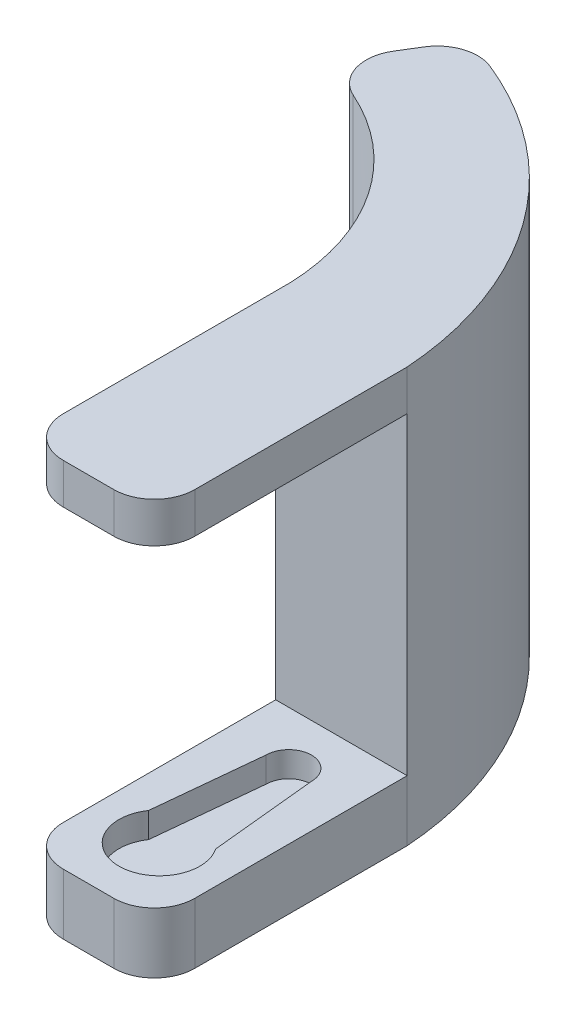
ISO-10303-21;
HEADER;
FILE_DESCRIPTION(('STEP AP214'),'2;1');
FILE_NAME('part.step','',(''),(''),'','','');
FILE_SCHEMA(('AUTOMOTIVE_DESIGN { 1 0 10303 214 1 1 1 1 }'));
ENDSEC;
DATA;
#1=APPLICATION_CONTEXT('core data for automotive mechanical design processes');
#2=APPLICATION_PROTOCOL_DEFINITION('international standard','automotive_design',2000,#1);
#3=PRODUCT_CONTEXT('',#1,'mechanical');
#4=PRODUCT('Part','Part','',(#3));
#5=PRODUCT_RELATED_PRODUCT_CATEGORY('part','',(#4));
#6=PRODUCT_DEFINITION_FORMATION('','',#4);
#7=PRODUCT_DEFINITION_CONTEXT('part definition',#1,'design');
#8=PRODUCT_DEFINITION('design','',#6,#7);
#9=PRODUCT_DEFINITION_SHAPE('','',#8);
#10=(LENGTH_UNIT() NAMED_UNIT(*) SI_UNIT(.MILLI.,.METRE.));
#11=(NAMED_UNIT(*) PLANE_ANGLE_UNIT() SI_UNIT($,.RADIAN.));
#12=(NAMED_UNIT(*) SI_UNIT($,.STERADIAN.) SOLID_ANGLE_UNIT());
#13=UNCERTAINTY_MEASURE_WITH_UNIT(LENGTH_MEASURE(1.E-05),#10,'distance_accuracy_value','');
#14=(GEOMETRIC_REPRESENTATION_CONTEXT(3) GLOBAL_UNCERTAINTY_ASSIGNED_CONTEXT((#13)) GLOBAL_UNIT_ASSIGNED_CONTEXT((#10,
#11,#12)) REPRESENTATION_CONTEXT('',''));
#15=CARTESIAN_POINT('',(0.,0.,0.));
#16=DIRECTION('',(0.,0.,1.));
#17=DIRECTION('',(1.,0.,0.));
#18=AXIS2_PLACEMENT_3D('',#15,#16,#17);
#19=CARTESIAN_POINT('',(-21.8206704125008,41.,-0.67001256969746));
#20=DIRECTION('',(0.,-1.,0.));
#21=DIRECTION('',(0.,0.,-1.));
#22=AXIS2_PLACEMENT_3D('',#19,#20,#21);
#23=CYLINDRICAL_SURFACE('',#22,21.8309544934375);
#24=CARTESIAN_POINT('',(-21.8206704125008,41.,-0.67001256969746));
#25=DIRECTION('',(0.,1.,0.));
#26=DIRECTION('',(0.,0.,1.));
#27=AXIS2_PLACEMENT_3D('',#24,#25,#26);
#28=CIRCLE('',#27,21.8309544934375);
#29=CARTESIAN_POINT('',(0.,41.,0.));
#30=VERTEX_POINT('',#29);
#31=CARTESIAN_POINT('',(-12.9454402488433,41.,-20.6154597603884));
#32=VERTEX_POINT('',#31);
#33=EDGE_CURVE('E294',#30,#32,#28,.T.);
#34=ORIENTED_EDGE('',*,*,#33,.T.);
#35=DIRECTION('',(0.,-1.,0.));
#36=VECTOR('',#35,1.);
#37=CARTESIAN_POINT('',(-12.9454402488433,41.,-20.6154597603884));
#38=LINE('',#37,#36);
#39=CARTESIAN_POINT('',(-12.9454402488433,27.,-20.6154597603884));
#40=VERTEX_POINT('',#39);
#41=EDGE_CURVE('E361',#32,#40,#38,.T.);
#42=ORIENTED_EDGE('',*,*,#41,.T.);
#43=CARTESIAN_POINT('',(-21.8206704125008,27.,-0.67001256969746));
#44=DIRECTION('',(0.,-1.,0.));
#45=DIRECTION('',(0.,0.,-1.));
#46=AXIS2_PLACEMENT_3D('',#43,#44,#45);
#47=CIRCLE('',#46,21.8309544934375);
#48=CARTESIAN_POINT('',(-7.30106149978512,27.,-16.9725133323512));
#49=VERTEX_POINT('',#48);
#50=EDGE_CURVE('E231',#40,#49,#47,.T.);
#51=ORIENTED_EDGE('',*,*,#50,.T.);
#52=DIRECTION('',(0.,-1.,0.));
#53=VECTOR('',#52,1.);
#54=CARTESIAN_POINT('',(-7.30106149978512,27.,-16.9725133323512));
#55=LINE('',#54,#53);
#56=CARTESIAN_POINT('',(-7.30106149978512,9.,-16.9725133323512));
#57=VERTEX_POINT('',#56);
#58=EDGE_CURVE('E230',#49,#57,#55,.T.);
#59=ORIENTED_EDGE('',*,*,#58,.T.);
#60=CARTESIAN_POINT('',(-21.8206704125008,9.,-0.67001256969746));
#61=DIRECTION('',(0.,-1.,0.));
#62=DIRECTION('',(0.,0.,-1.));
#63=AXIS2_PLACEMENT_3D('',#60,#61,#62);
#64=CIRCLE('',#63,21.8309544934375);
#65=CARTESIAN_POINT('',(-12.9454402488433,9.,-20.6154597603884));
#66=VERTEX_POINT('',#65);
#67=EDGE_CURVE('E437',#66,#57,#64,.T.);
#68=ORIENTED_EDGE('',*,*,#67,.F.);
#69=DIRECTION('',(0.,-1.,0.));
#70=VECTOR('',#69,1.);
#71=CARTESIAN_POINT('',(-12.9454402488433,41.,-20.6154597603884));
#72=LINE('',#71,#70);
#73=CARTESIAN_POINT('',(-12.9454402488433,0.,-20.6154597603884));
#74=VERTEX_POINT('',#73);
#75=EDGE_CURVE('E358',#66,#74,#72,.T.);
#76=ORIENTED_EDGE('',*,*,#75,.T.);
#77=CARTESIAN_POINT('',(-21.8206704125008,0.,-0.67001256969746));
#78=DIRECTION('',(0.,1.,0.));
#79=DIRECTION('',(0.,0.,1.));
#80=AXIS2_PLACEMENT_3D('',#77,#78,#79);
#81=CIRCLE('',#80,21.8309544934375);
#82=CARTESIAN_POINT('',(0.,0.,0.));
#83=VERTEX_POINT('',#82);
#84=EDGE_CURVE('E293',#83,#74,#81,.T.);
#85=ORIENTED_EDGE('',*,*,#84,.F.);
#86=DIRECTION('',(0.,-1.,0.));
#87=VECTOR('',#86,1.);
#88=CARTESIAN_POINT('',(0.,6.,0.));
#89=LINE('',#88,#87);
#90=CARTESIAN_POINT('',(0.,6.,0.));
#91=VERTEX_POINT('',#90);
#92=EDGE_CURVE('E282',#91,#83,#89,.T.);
#93=ORIENTED_EDGE('',*,*,#92,.F.);
#94=DIRECTION('',(0.,-1.,0.));
#95=VECTOR('',#94,1.);
#96=CARTESIAN_POINT('',(0.,41.,0.));
#97=LINE('',#96,#95);
#98=CARTESIAN_POINT('',(0.,37.,0.));
#99=VERTEX_POINT('',#98);
#100=EDGE_CURVE('E312',#99,#91,#97,.T.);
#101=ORIENTED_EDGE('',*,*,#100,.F.);
#102=DIRECTION('',(0.,-1.,0.));
#103=VECTOR('',#102,1.);
#104=CARTESIAN_POINT('',(0.,41.,0.));
#105=LINE('',#104,#103);
#106=EDGE_CURVE('E327',#30,#99,#105,.T.);
#107=ORIENTED_EDGE('',*,*,#106,.F.);
#108=EDGE_LOOP('',(#34,#42,#51,#59,#68,#76,#85,#93,#101,#107));
#109=FACE_BOUND('',#108,.T.);
#110=ADVANCED_FACE('F34',(#109),#23,.F.);
#111=CARTESIAN_POINT('',(-21.7491965770978,41.,2.42735962413155));
#112=DIRECTION('',(0.,-1.,0.));
#113=DIRECTION('',(0.,0.,-1.));
#114=AXIS2_PLACEMENT_3D('',#111,#112,#113);
#115=CYLINDRICAL_SURFACE('',#114,34.8338734208334);
#116=CARTESIAN_POINT('',(-21.7491965770978,27.,2.42735962413155));
#117=DIRECTION('',(0.,-1.,0.));
#118=DIRECTION('',(0.,0.,-1.));
#119=AXIS2_PLACEMENT_3D('',#116,#117,#118);
#120=CIRCLE('',#119,34.8338734208334);
#121=CARTESIAN_POINT('',(-8.66476899042789,27.,-29.8557085731114));
#122=VERTEX_POINT('',#121);
#123=CARTESIAN_POINT('',(-1.72066987913425,27.,-26.0727606529411));
#124=VERTEX_POINT('',#123);
#125=EDGE_CURVE('E210',#122,#124,#120,.T.);
#126=ORIENTED_EDGE('',*,*,#125,.F.);
#127=DIRECTION('',(0.,-1.,0.));
#128=VECTOR('',#127,1.);
#129=CARTESIAN_POINT('',(-8.66476899042788,41.,-29.8557085731114));
#130=LINE('',#129,#128);
#131=CARTESIAN_POINT('',(-8.66476899042789,41.,-29.8557085731114));
#132=VERTEX_POINT('',#131);
#133=EDGE_CURVE('E352',#122,#132,#130,.F.);
#134=ORIENTED_EDGE('',*,*,#133,.T.);
#135=CARTESIAN_POINT('',(-21.7491965770978,41.,2.42735962413155));
#136=DIRECTION('',(0.,-1.,0.));
#137=DIRECTION('',(0.,0.,1.));
#138=AXIS2_PLACEMENT_3D('',#135,#136,#137);
#139=CIRCLE('',#138,34.8338734208334);
#140=CARTESIAN_POINT('',(13.,41.,0.));
#141=VERTEX_POINT('',#140);
#142=EDGE_CURVE('E301',#132,#141,#139,.T.);
#143=ORIENTED_EDGE('',*,*,#142,.T.);
#144=DIRECTION('',(0.,-1.,0.));
#145=VECTOR('',#144,1.);
#146=CARTESIAN_POINT('',(13.,41.,0.));
#147=LINE('',#146,#145);
#148=CARTESIAN_POINT('',(13.,37.,0.));
#149=VERTEX_POINT('',#148);
#150=EDGE_CURVE('E339',#141,#149,#147,.T.);
#151=ORIENTED_EDGE('',*,*,#150,.T.);
#152=DIRECTION('',(0.,-1.,0.));
#153=VECTOR('',#152,1.);
#154=CARTESIAN_POINT('',(13.,41.,0.));
#155=LINE('',#154,#153);
#156=CARTESIAN_POINT('',(13.,6.,0.));
#157=VERTEX_POINT('',#156);
#158=EDGE_CURVE('E304',#149,#157,#155,.T.);
#159=ORIENTED_EDGE('',*,*,#158,.T.);
#160=DIRECTION('',(0.,-1.,0.));
#161=VECTOR('',#160,1.);
#162=CARTESIAN_POINT('',(13.,6.,0.));
#163=LINE('',#162,#161);
#164=CARTESIAN_POINT('',(13.,0.,0.));
#165=VERTEX_POINT('',#164);
#166=EDGE_CURVE('E290',#157,#165,#163,.T.);
#167=ORIENTED_EDGE('',*,*,#166,.T.);
#168=CARTESIAN_POINT('',(-21.7491965770978,0.,2.42735962413155));
#169=DIRECTION('',(0.,-1.,0.));
#170=DIRECTION('',(0.,0.,1.));
#171=AXIS2_PLACEMENT_3D('',#168,#169,#170);
#172=CIRCLE('',#171,34.8338734208334);
#173=CARTESIAN_POINT('',(-8.66476899042789,0.,-29.8557085731114));
#174=VERTEX_POINT('',#173);
#175=EDGE_CURVE('E298',#174,#165,#172,.T.);
#176=ORIENTED_EDGE('',*,*,#175,.F.);
#177=DIRECTION('',(0.,-1.,0.));
#178=VECTOR('',#177,1.);
#179=CARTESIAN_POINT('',(-8.66476899042788,41.,-29.8557085731114));
#180=LINE('',#179,#178);
#181=CARTESIAN_POINT('',(-8.66476899042789,9.,-29.8557085731114));
#182=VERTEX_POINT('',#181);
#183=EDGE_CURVE('E350',#174,#182,#180,.F.);
#184=ORIENTED_EDGE('',*,*,#183,.T.);
#185=CARTESIAN_POINT('',(-21.7491965770978,9.,2.42735962413155));
#186=DIRECTION('',(0.,-1.,0.));
#187=DIRECTION('',(0.,0.,-1.));
#188=AXIS2_PLACEMENT_3D('',#185,#186,#187);
#189=CIRCLE('',#188,34.8338734208334);
#190=CARTESIAN_POINT('',(-1.72066987913425,9.,-26.0727606529411));
#191=VERTEX_POINT('',#190);
#192=EDGE_CURVE('E235',#182,#191,#189,.T.);
#193=ORIENTED_EDGE('',*,*,#192,.T.);
#194=DIRECTION('',(0.,-1.,0.));
#195=VECTOR('',#194,1.);
#196=CARTESIAN_POINT('',(-1.72066987913425,27.,-26.0727606529411));
#197=LINE('',#196,#195);
#198=EDGE_CURVE('E227',#124,#191,#197,.T.);
#199=ORIENTED_EDGE('',*,*,#198,.F.);
#200=EDGE_LOOP('',(#126,#134,#143,#151,#159,#167,#176,#184,#193,#199));
#201=FACE_BOUND('',#200,.T.);
#202=ADVANCED_FACE('F233',(#201),#115,.T.);
#203=CARTESIAN_POINT('',(-17.3765441053367,41.,-22.0438357059665));
#204=DIRECTION('',(-0.852483505207797,0.,-0.522754123224894));
#205=DIRECTION('',(-0.522754123224894,0.,0.852483505207797));
#206=AXIS2_PLACEMENT_3D('',#203,#204,#205);
#207=PLANE('',#206);
#208=DIRECTION('',(0.522754123224894,0.,-0.852483505207797));
#209=VECTOR('',#208,1.);
#210=CARTESIAN_POINT('',(-17.3765441053367,41.,-22.0438357059665));
#211=LINE('',#210,#209);
#212=CARTESIAN_POINT('',(-14.7292007248896,41.,-26.3610021599197));
#213=VERTEX_POINT('',#212);
#214=CARTESIAN_POINT('',(-13.5771977156056,41.,-28.2396359568297));
#215=VERTEX_POINT('',#214);
#216=EDGE_CURVE('E297',#213,#215,#211,.T.);
#217=ORIENTED_EDGE('',*,*,#216,.T.);
#218=DIRECTION('',(0.,-1.,0.));
#219=VECTOR('',#218,1.);
#220=CARTESIAN_POINT('',(-13.5771977156056,41.,-28.2396359568297));
#221=LINE('',#220,#219);
#222=CARTESIAN_POINT('',(-13.5771977156056,27.,-28.2396359568297));
#223=VERTEX_POINT('',#222);
#224=EDGE_CURVE('E344',#215,#223,#221,.T.);
#225=ORIENTED_EDGE('',*,*,#224,.T.);
#226=DIRECTION('',(0.522754123224895,0.,-0.852483505207797));
#227=VECTOR('',#226,1.);
#228=CARTESIAN_POINT('',(-22.4516221384649,27.,-13.767630662964));
#229=LINE('',#228,#227);
#230=CARTESIAN_POINT('',(-14.7292007248896,27.,-26.3610021599197));
#231=VERTEX_POINT('',#230);
#232=EDGE_CURVE('E220',#231,#223,#229,.T.);
#233=ORIENTED_EDGE('',*,*,#232,.F.);
#234=DIRECTION('',(0.,-1.,0.));
#235=VECTOR('',#234,1.);
#236=CARTESIAN_POINT('',(-14.7292007248896,41.,-26.3610021599197));
#237=LINE('',#236,#235);
#238=EDGE_CURVE('E342',#231,#213,#237,.F.);
#239=ORIENTED_EDGE('',*,*,#238,.T.);
#240=EDGE_LOOP('',(#217,#225,#233,#239));
#241=FACE_BOUND('',#240,.T.);
#242=ADVANCED_FACE('F473',(#241),#207,.T.);
#243=CARTESIAN_POINT('',(0.,41.,0.));
#244=DIRECTION('',(1.,0.,0.));
#245=DIRECTION('',(0.,0.,-1.));
#246=AXIS2_PLACEMENT_3D('',#243,#244,#245);
#247=PLANE('',#246);
#248=DIRECTION('',(0.,0.,1.));
#249=VECTOR('',#248,1.);
#250=CARTESIAN_POINT('',(0.,37.,0.));
#251=LINE('',#250,#249);
#252=CARTESIAN_POINT('',(0.,37.,21.));
#253=VERTEX_POINT('',#252);
#254=EDGE_CURVE('E315',#99,#253,#251,.T.);
#255=ORIENTED_EDGE('',*,*,#254,.T.);
#256=DIRECTION('',(0.,-1.,0.));
#257=VECTOR('',#256,1.);
#258=CARTESIAN_POINT('',(0.,41.,21.));
#259=LINE('',#258,#257);
#260=CARTESIAN_POINT('',(0.,41.,21.));
#261=VERTEX_POINT('',#260);
#262=EDGE_CURVE('E386',#253,#261,#259,.F.);
#263=ORIENTED_EDGE('',*,*,#262,.T.);
#264=DIRECTION('',(0.,0.,1.));
#265=VECTOR('',#264,1.);
#266=CARTESIAN_POINT('',(0.,41.,0.));
#267=LINE('',#266,#265);
#268=EDGE_CURVE('E318',#30,#261,#267,.T.);
#269=ORIENTED_EDGE('',*,*,#268,.F.);
#270=ORIENTED_EDGE('',*,*,#106,.T.);
#271=EDGE_LOOP('',(#255,#263,#269,#270));
#272=FACE_BOUND('',#271,.T.);
#273=ADVANCED_FACE('F499',(#272),#247,.F.);
#274=CARTESIAN_POINT('',(0.,41.,25.));
#275=DIRECTION('',(0.,0.,-1.));
#276=DIRECTION('',(-1.,0.,0.));
#277=AXIS2_PLACEMENT_3D('',#274,#275,#276);
#278=PLANE('',#277);
#279=DIRECTION('',(1.,0.,0.));
#280=VECTOR('',#279,1.);
#281=CARTESIAN_POINT('',(0.,41.,25.));
#282=LINE('',#281,#280);
#283=CARTESIAN_POINT('',(4.,41.,25.));
#284=VERTEX_POINT('',#283);
#285=CARTESIAN_POINT('',(9.,41.,25.));
#286=VERTEX_POINT('',#285);
#287=EDGE_CURVE('E321',#284,#286,#282,.T.);
#288=ORIENTED_EDGE('',*,*,#287,.F.);
#289=DIRECTION('',(0.,-1.,0.));
#290=VECTOR('',#289,1.);
#291=CARTESIAN_POINT('',(4.,41.,25.));
#292=LINE('',#291,#290);
#293=CARTESIAN_POINT('',(4.,37.,25.));
#294=VERTEX_POINT('',#293);
#295=EDGE_CURVE('E379',#284,#294,#292,.T.);
#296=ORIENTED_EDGE('',*,*,#295,.T.);
#297=DIRECTION('',(1.,0.,0.));
#298=VECTOR('',#297,1.);
#299=CARTESIAN_POINT('',(0.,37.,25.));
#300=LINE('',#299,#298);
#301=CARTESIAN_POINT('',(9.,37.,25.));
#302=VERTEX_POINT('',#301);
#303=EDGE_CURVE('E330',#294,#302,#300,.T.);
#304=ORIENTED_EDGE('',*,*,#303,.T.);
#305=DIRECTION('',(0.,-1.,0.));
#306=VECTOR('',#305,1.);
#307=CARTESIAN_POINT('',(9.,41.,25.));
#308=LINE('',#307,#306);
#309=EDGE_CURVE('E377',#302,#286,#308,.F.);
#310=ORIENTED_EDGE('',*,*,#309,.T.);
#311=EDGE_LOOP('',(#288,#296,#304,#310));
#312=FACE_BOUND('',#311,.T.);
#313=ADVANCED_FACE('F494',(#312),#278,.F.);
#314=CARTESIAN_POINT('',(13.,41.,0.));
#315=DIRECTION('',(-1.,0.,0.));
#316=DIRECTION('',(0.,0.,1.));
#317=AXIS2_PLACEMENT_3D('',#314,#315,#316);
#318=PLANE('',#317);
#319=DIRECTION('',(0.,0.,-1.));
#320=VECTOR('',#319,1.);
#321=CARTESIAN_POINT('',(13.,41.,0.));
#322=LINE('',#321,#320);
#323=CARTESIAN_POINT('',(13.,41.,21.));
#324=VERTEX_POINT('',#323);
#325=EDGE_CURVE('E325',#324,#141,#322,.T.);
#326=ORIENTED_EDGE('',*,*,#325,.F.);
#327=DIRECTION('',(0.,-1.,0.));
#328=VECTOR('',#327,1.);
#329=CARTESIAN_POINT('',(13.,41.,21.));
#330=LINE('',#329,#328);
#331=CARTESIAN_POINT('',(13.,37.,21.));
#332=VERTEX_POINT('',#331);
#333=EDGE_CURVE('E392',#324,#332,#330,.T.);
#334=ORIENTED_EDGE('',*,*,#333,.T.);
#335=DIRECTION('',(0.,0.,-1.));
#336=VECTOR('',#335,1.);
#337=CARTESIAN_POINT('',(13.,37.,0.));
#338=LINE('',#337,#336);
#339=EDGE_CURVE('E333',#332,#149,#338,.T.);
#340=ORIENTED_EDGE('',*,*,#339,.T.);
#341=ORIENTED_EDGE('',*,*,#150,.F.);
#342=EDGE_LOOP('',(#326,#334,#340,#341));
#343=FACE_BOUND('',#342,.T.);
#344=ADVANCED_FACE('F484',(#343),#318,.F.);
#345=CARTESIAN_POINT('',(0.,41.,0.));
#346=DIRECTION('',(0.,1.,0.));
#347=DIRECTION('',(0.,0.,1.));
#348=AXIS2_PLACEMENT_3D('',#345,#346,#347);
#349=PLANE('',#348);
#350=ORIENTED_EDGE('',*,*,#268,.T.);
#351=CARTESIAN_POINT('',(4.,41.,21.));
#352=DIRECTION('',(0.,1.,0.));
#353=DIRECTION('',(0.,0.,1.));
#354=AXIS2_PLACEMENT_3D('',#351,#352,#353);
#355=CIRCLE('',#354,4.);
#356=EDGE_CURVE('E390',#261,#284,#355,.T.);
#357=ORIENTED_EDGE('',*,*,#356,.T.);
#358=ORIENTED_EDGE('',*,*,#287,.T.);
#359=CARTESIAN_POINT('',(9.,41.,21.));
#360=DIRECTION('',(0.,1.,0.));
#361=DIRECTION('',(0.,0.,1.));
#362=AXIS2_PLACEMENT_3D('',#359,#360,#361);
#363=CIRCLE('',#362,4.);
#364=EDGE_CURVE('E388',#286,#324,#363,.T.);
#365=ORIENTED_EDGE('',*,*,#364,.T.);
#366=ORIENTED_EDGE('',*,*,#325,.T.);
#367=ORIENTED_EDGE('',*,*,#142,.F.);
#368=CARTESIAN_POINT('',(-10.1672636947744,41.,-26.1486194639301));
#369=DIRECTION('',(0.,1.,0.));
#370=DIRECTION('',(0.,0.,1.));
#371=AXIS2_PLACEMENT_3D('',#368,#369,#370);
#372=CIRCLE('',#371,4.);
#373=EDGE_CURVE('E356',#132,#215,#372,.T.);
#374=ORIENTED_EDGE('',*,*,#373,.T.);
#375=ORIENTED_EDGE('',*,*,#216,.F.);
#376=CARTESIAN_POINT('',(-11.3192667040584,41.,-24.2699856670201));
#377=DIRECTION('',(0.,1.,0.));
#378=DIRECTION('',(0.,0.,1.));
#379=AXIS2_PLACEMENT_3D('',#376,#377,#378);
#380=CIRCLE('',#379,4.);
#381=EDGE_CURVE('E354',#213,#32,#380,.T.);
#382=ORIENTED_EDGE('',*,*,#381,.T.);
#383=ORIENTED_EDGE('',*,*,#33,.F.);
#384=EDGE_LOOP('',(#350,#357,#358,#365,#366,#367,#374,#375,#382,#383));
#385=FACE_BOUND('',#384,.T.);
#386=ADVANCED_FACE('F464',(#385),#349,.T.);
#387=CARTESIAN_POINT('',(0.,37.,0.));
#388=DIRECTION('',(0.,1.,0.));
#389=DIRECTION('',(0.,0.,1.));
#390=AXIS2_PLACEMENT_3D('',#387,#388,#389);
#391=PLANE('',#390);
#392=ORIENTED_EDGE('',*,*,#303,.F.);
#393=CARTESIAN_POINT('',(4.,37.,21.));
#394=DIRECTION('',(0.,1.,0.));
#395=DIRECTION('',(0.,0.,1.));
#396=AXIS2_PLACEMENT_3D('',#393,#394,#395);
#397=CIRCLE('',#396,4.);
#398=EDGE_CURVE('E384',#294,#253,#397,.F.);
#399=ORIENTED_EDGE('',*,*,#398,.T.);
#400=ORIENTED_EDGE('',*,*,#254,.F.);
#401=DIRECTION('',(-1.,0.,0.));
#402=VECTOR('',#401,1.);
#403=CARTESIAN_POINT('',(0.,37.,0.));
#404=LINE('',#403,#402);
#405=EDGE_CURVE('E322',#149,#99,#404,.T.);
#406=ORIENTED_EDGE('',*,*,#405,.F.);
#407=ORIENTED_EDGE('',*,*,#339,.F.);
#408=CARTESIAN_POINT('',(9.,37.,21.));
#409=DIRECTION('',(0.,1.,0.));
#410=DIRECTION('',(0.,0.,1.));
#411=AXIS2_PLACEMENT_3D('',#408,#409,#410);
#412=CIRCLE('',#411,4.);
#413=EDGE_CURVE('E382',#332,#302,#412,.F.);
#414=ORIENTED_EDGE('',*,*,#413,.T.);
#415=EDGE_LOOP('',(#392,#399,#400,#406,#407,#414));
#416=FACE_BOUND('',#415,.T.);
#417=ADVANCED_FACE('F491',(#416),#391,.F.);
#418=CARTESIAN_POINT('',(0.,41.,0.));
#419=DIRECTION('',(0.,0.,1.));
#420=DIRECTION('',(1.,0.,0.));
#421=AXIS2_PLACEMENT_3D('',#418,#419,#420);
#422=PLANE('',#421);
#423=DIRECTION('',(-1.,0.,0.));
#424=VECTOR('',#423,1.);
#425=CARTESIAN_POINT('',(0.,6.,0.));
#426=LINE('',#425,#424);
#427=EDGE_CURVE('E280',#157,#91,#426,.T.);
#428=ORIENTED_EDGE('',*,*,#427,.F.);
#429=ORIENTED_EDGE('',*,*,#158,.F.);
#430=ORIENTED_EDGE('',*,*,#405,.T.);
#431=ORIENTED_EDGE('',*,*,#100,.T.);
#432=EDGE_LOOP('',(#428,#429,#430,#431));
#433=FACE_BOUND('',#432,.T.);
#434=ADVANCED_FACE('F457',(#433),#422,.T.);
#435=DIRECTION('',(0.522754123224894,0.,-0.852483505207797));
#436=VECTOR('',#435,1.);
#437=CARTESIAN_POINT('',(-17.3765441053367,0.,-22.0438357059665));
#438=LINE('',#437,#436);
#439=CARTESIAN_POINT('',(-14.7292007248896,0.,-26.3610021599197));
#440=VERTEX_POINT('',#439);
#441=CARTESIAN_POINT('',(-13.5771977156056,0.,-28.2396359568297));
#442=VERTEX_POINT('',#441);
#443=EDGE_CURVE('E307',#440,#442,#438,.T.);
#444=ORIENTED_EDGE('',*,*,#443,.F.);
#445=DIRECTION('',(0.,-1.,0.));
#446=VECTOR('',#445,1.);
#447=CARTESIAN_POINT('',(-14.7292007248896,41.,-26.3610021599197));
#448=LINE('',#447,#446);
#449=CARTESIAN_POINT('',(-14.7292007248896,9.,-26.3610021599197));
#450=VERTEX_POINT('',#449);
#451=EDGE_CURVE('E371',#440,#450,#448,.F.);
#452=ORIENTED_EDGE('',*,*,#451,.T.);
#453=DIRECTION('',(0.522754123224895,0.,-0.852483505207797));
#454=VECTOR('',#453,1.);
#455=CARTESIAN_POINT('',(-22.4516221384649,9.,-13.767630662964));
#456=LINE('',#455,#454);
#457=CARTESIAN_POINT('',(-13.5771977156056,9.,-28.2396359568297));
#458=VERTEX_POINT('',#457);
#459=EDGE_CURVE('E438',#450,#458,#456,.T.);
#460=ORIENTED_EDGE('',*,*,#459,.T.);
#461=DIRECTION('',(0.,-1.,0.));
#462=VECTOR('',#461,1.);
#463=CARTESIAN_POINT('',(-13.5771977156056,41.,-28.2396359568297));
#464=LINE('',#463,#462);
#465=EDGE_CURVE('E368',#458,#442,#464,.T.);
#466=ORIENTED_EDGE('',*,*,#465,.T.);
#467=EDGE_LOOP('',(#444,#452,#460,#466));
#468=FACE_BOUND('',#467,.T.);
#469=ADVANCED_FACE('F429',(#468),#207,.T.);
#470=CARTESIAN_POINT('',(-21.8206704125008,0.,-0.67001256969746));
#471=DIRECTION('',(0.,1.,0.));
#472=DIRECTION('',(0.,0.,1.));
#473=AXIS2_PLACEMENT_3D('',#470,#471,#472);
#474=PLANE('',#473);
#475=DIRECTION('',(1.,0.,0.));
#476=VECTOR('',#475,1.);
#477=CARTESIAN_POINT('',(0.,0.,25.));
#478=LINE('',#477,#476);
#479=CARTESIAN_POINT('',(4.,0.,25.));
#480=VERTEX_POINT('',#479);
#481=CARTESIAN_POINT('',(9.,0.,25.));
#482=VERTEX_POINT('',#481);
#483=EDGE_CURVE('E284',#480,#482,#478,.T.);
#484=ORIENTED_EDGE('',*,*,#483,.F.);
#485=CARTESIAN_POINT('',(4.,0.,21.));
#486=DIRECTION('',(0.,1.,0.));
#487=DIRECTION('',(0.,0.,1.));
#488=AXIS2_PLACEMENT_3D('',#485,#486,#487);
#489=CIRCLE('',#488,4.);
#490=CARTESIAN_POINT('',(0.,0.,21.));
#491=VERTEX_POINT('',#490);
#492=EDGE_CURVE('E402',#480,#491,#489,.F.);
#493=ORIENTED_EDGE('',*,*,#492,.T.);
#494=DIRECTION('',(0.,0.,1.));
#495=VECTOR('',#494,1.);
#496=CARTESIAN_POINT('',(0.,0.,0.));
#497=LINE('',#496,#495);
#498=EDGE_CURVE('E266',#83,#491,#497,.T.);
#499=ORIENTED_EDGE('',*,*,#498,.F.);
#500=ORIENTED_EDGE('',*,*,#84,.T.);
#501=CARTESIAN_POINT('',(-11.3192667040584,0.,-24.2699856670201));
#502=DIRECTION('',(0.,1.,0.));
#503=DIRECTION('',(0.,0.,1.));
#504=AXIS2_PLACEMENT_3D('',#501,#502,#503);
#505=CIRCLE('',#504,4.);
#506=EDGE_CURVE('E366',#74,#440,#505,.F.);
#507=ORIENTED_EDGE('',*,*,#506,.T.);
#508=ORIENTED_EDGE('',*,*,#443,.T.);
#509=CARTESIAN_POINT('',(-10.1672636947744,0.,-26.1486194639301));
#510=DIRECTION('',(0.,1.,0.));
#511=DIRECTION('',(0.,0.,1.));
#512=AXIS2_PLACEMENT_3D('',#509,#510,#511);
#513=CIRCLE('',#512,4.);
#514=EDGE_CURVE('E364',#442,#174,#513,.F.);
#515=ORIENTED_EDGE('',*,*,#514,.T.);
#516=ORIENTED_EDGE('',*,*,#175,.T.);
#517=DIRECTION('',(0.,0.,-1.));
#518=VECTOR('',#517,1.);
#519=CARTESIAN_POINT('',(13.,0.,0.));
#520=LINE('',#519,#518);
#521=CARTESIAN_POINT('',(13.,0.,21.));
#522=VERTEX_POINT('',#521);
#523=EDGE_CURVE('E276',#522,#165,#520,.T.);
#524=ORIENTED_EDGE('',*,*,#523,.F.);
#525=CARTESIAN_POINT('',(9.,0.,21.));
#526=DIRECTION('',(0.,1.,0.));
#527=DIRECTION('',(0.,0.,1.));
#528=AXIS2_PLACEMENT_3D('',#525,#526,#527);
#529=CIRCLE('',#528,4.);
#530=EDGE_CURVE('E400',#522,#482,#529,.F.);
#531=ORIENTED_EDGE('',*,*,#530,.T.);
#532=EDGE_LOOP('',(#484,#493,#499,#500,#507,#508,#515,#516,#524,#531));
#533=FACE_BOUND('',#532,.T.);
#534=ADVANCED_FACE('F417',(#533),#474,.F.);
#535=CARTESIAN_POINT('',(0.,6.,0.));
#536=DIRECTION('',(0.,1.,0.));
#537=DIRECTION('',(0.,0.,1.));
#538=AXIS2_PLACEMENT_3D('',#535,#536,#537);
#539=PLANE('',#538);
#540=DIRECTION('',(0.,0.,1.));
#541=VECTOR('',#540,1.);
#542=CARTESIAN_POINT('',(0.,6.,0.));
#543=LINE('',#542,#541);
#544=CARTESIAN_POINT('',(0.,6.,21.));
#545=VERTEX_POINT('',#544);
#546=EDGE_CURVE('E273',#91,#545,#543,.T.);
#547=ORIENTED_EDGE('',*,*,#546,.T.);
#548=CARTESIAN_POINT('',(4.,6.,21.));
#549=DIRECTION('',(0.,1.,0.));
#550=DIRECTION('',(0.,0.,1.));
#551=AXIS2_PLACEMENT_3D('',#548,#549,#550);
#552=CIRCLE('',#551,4.);
#553=CARTESIAN_POINT('',(4.,6.,25.));
#554=VERTEX_POINT('',#553);
#555=EDGE_CURVE('E42',#545,#554,#552,.T.);
#556=ORIENTED_EDGE('',*,*,#555,.T.);
#557=DIRECTION('',(1.,0.,0.));
#558=VECTOR('',#557,1.);
#559=CARTESIAN_POINT('',(0.,6.,25.));
#560=LINE('',#559,#558);
#561=CARTESIAN_POINT('',(9.,6.,25.));
#562=VERTEX_POINT('',#561);
#563=EDGE_CURVE('E275',#554,#562,#560,.T.);
#564=ORIENTED_EDGE('',*,*,#563,.T.);
#565=CARTESIAN_POINT('',(9.,6.,21.));
#566=DIRECTION('',(0.,1.,0.));
#567=DIRECTION('',(0.,0.,1.));
#568=AXIS2_PLACEMENT_3D('',#565,#566,#567);
#569=CIRCLE('',#568,4.);
#570=CARTESIAN_POINT('',(13.,6.,21.));
#571=VERTEX_POINT('',#570);
#572=EDGE_CURVE('E49',#562,#571,#569,.T.);
#573=ORIENTED_EDGE('',*,*,#572,.T.);
#574=DIRECTION('',(0.,0.,-1.));
#575=VECTOR('',#574,1.);
#576=CARTESIAN_POINT('',(13.,6.,0.));
#577=LINE('',#576,#575);
#578=EDGE_CURVE('E278',#571,#157,#577,.T.);
#579=ORIENTED_EDGE('',*,*,#578,.T.);
#580=ORIENTED_EDGE('',*,*,#427,.T.);
#581=EDGE_LOOP('',(#547,#556,#564,#573,#579,#580));
#582=FACE_BOUND('',#581,.T.);
#583=DIRECTION('',(0.0997805220615176,0.,-0.99500947101881));
#584=VECTOR('',#583,1.);
#585=CARTESIAN_POINT('',(4.7247231395392,6.,0.473799853358825));
#586=LINE('',#585,#584);
#587=CARTESIAN_POINT('',(3.19281086116927,6.,15.75));
#588=VERTEX_POINT('',#587);
#589=CARTESIAN_POINT('',(4.25,6.,5.20772998515413));
#590=VERTEX_POINT('',#589);
#591=EDGE_CURVE('E256',#588,#590,#586,.T.);
#592=ORIENTED_EDGE('',*,*,#591,.T.);
#593=CARTESIAN_POINT('',(6.5,6.,5.20772998515413));
#594=DIRECTION('',(0.,1.,0.));
#595=DIRECTION('',(0.,0.,1.));
#596=AXIS2_PLACEMENT_3D('',#593,#594,#595);
#597=CIRCLE('',#596,2.25);
#598=CARTESIAN_POINT('',(8.75,6.,5.20772998515413));
#599=VERTEX_POINT('',#598);
#600=EDGE_CURVE('E237',#590,#599,#597,.F.);
#601=ORIENTED_EDGE('',*,*,#600,.T.);
#602=DIRECTION('',(-0.0997805220615176,0.,-0.99500947101881));
#603=VECTOR('',#602,1.);
#604=CARTESIAN_POINT('',(8.14584687688351,6.,-0.816873484808522));
#605=LINE('',#604,#603);
#606=CARTESIAN_POINT('',(9.80718913883074,6.,15.75));
#607=VERTEX_POINT('',#606);
#608=EDGE_CURVE('E245',#607,#599,#605,.T.);
#609=ORIENTED_EDGE('',*,*,#608,.F.);
#610=CARTESIAN_POINT('',(6.5,6.,18.));
#611=DIRECTION('',(0.,1.,0.));
#612=DIRECTION('',(0.,0.,1.));
#613=AXIS2_PLACEMENT_3D('',#610,#611,#612);
#614=CIRCLE('',#613,4.);
#615=EDGE_CURVE('E259',#588,#607,#614,.T.);
#616=ORIENTED_EDGE('',*,*,#615,.F.);
#617=EDGE_LOOP('',(#592,#601,#609,#616));
#618=FACE_BOUND('',#617,.T.);
#619=ADVANCED_FACE('F407',(#582,#618),#539,.T.);
#620=CARTESIAN_POINT('',(0.,6.,0.));
#621=DIRECTION('',(1.,0.,0.));
#622=DIRECTION('',(0.,0.,-1.));
#623=AXIS2_PLACEMENT_3D('',#620,#621,#622);
#624=PLANE('',#623);
#625=ORIENTED_EDGE('',*,*,#498,.T.);
#626=DIRECTION('',(0.,-1.,0.));
#627=VECTOR('',#626,1.);
#628=CARTESIAN_POINT('',(0.,6.,21.));
#629=LINE('',#628,#627);
#630=EDGE_CURVE('E57',#491,#545,#629,.F.);
#631=ORIENTED_EDGE('',*,*,#630,.T.);
#632=ORIENTED_EDGE('',*,*,#546,.F.);
#633=ORIENTED_EDGE('',*,*,#92,.T.);
#634=EDGE_LOOP('',(#625,#631,#632,#633));
#635=FACE_BOUND('',#634,.T.);
#636=ADVANCED_FACE('F418',(#635),#624,.F.);
#637=CARTESIAN_POINT('',(0.,6.,25.));
#638=DIRECTION('',(0.,0.,-1.));
#639=DIRECTION('',(-1.,0.,0.));
#640=AXIS2_PLACEMENT_3D('',#637,#638,#639);
#641=PLANE('',#640);
#642=ORIENTED_EDGE('',*,*,#563,.F.);
#643=DIRECTION('',(0.,-1.,0.));
#644=VECTOR('',#643,1.);
#645=CARTESIAN_POINT('',(4.,6.,25.));
#646=LINE('',#645,#644);
#647=EDGE_CURVE('E397',#554,#480,#646,.T.);
#648=ORIENTED_EDGE('',*,*,#647,.T.);
#649=ORIENTED_EDGE('',*,*,#483,.T.);
#650=DIRECTION('',(0.,-1.,0.));
#651=VECTOR('',#650,1.);
#652=CARTESIAN_POINT('',(9.,6.,25.));
#653=LINE('',#652,#651);
#654=EDGE_CURVE('E395',#482,#562,#653,.F.);
#655=ORIENTED_EDGE('',*,*,#654,.T.);
#656=EDGE_LOOP('',(#642,#648,#649,#655));
#657=FACE_BOUND('',#656,.T.);
#658=ADVANCED_FACE('F412',(#657),#641,.F.);
#659=CARTESIAN_POINT('',(13.,6.,0.));
#660=DIRECTION('',(-1.,0.,0.));
#661=DIRECTION('',(0.,0.,1.));
#662=AXIS2_PLACEMENT_3D('',#659,#660,#661);
#663=PLANE('',#662);
#664=ORIENTED_EDGE('',*,*,#578,.F.);
#665=DIRECTION('',(0.,-1.,0.));
#666=VECTOR('',#665,1.);
#667=CARTESIAN_POINT('',(13.,6.,21.));
#668=LINE('',#667,#666);
#669=EDGE_CURVE('E11',#571,#522,#668,.T.);
#670=ORIENTED_EDGE('',*,*,#669,.T.);
#671=ORIENTED_EDGE('',*,*,#523,.T.);
#672=ORIENTED_EDGE('',*,*,#166,.F.);
#673=EDGE_LOOP('',(#664,#670,#671,#672));
#674=FACE_BOUND('',#673,.T.);
#675=ADVANCED_FACE('F454',(#674),#663,.F.);
#676=CARTESIAN_POINT('',(6.5,3.5,5.20772998515413));
#677=DIRECTION('',(0.,1.,0.));
#678=DIRECTION('',(0.,0.,1.));
#679=AXIS2_PLACEMENT_3D('',#676,#677,#678);
#680=CYLINDRICAL_SURFACE('',#679,2.25);
#681=ORIENTED_EDGE('',*,*,#600,.F.);
#682=DIRECTION('',(0.,1.,0.));
#683=VECTOR('',#682,1.);
#684=CARTESIAN_POINT('',(4.25,3.5,5.20772998515413));
#685=LINE('',#684,#683);
#686=CARTESIAN_POINT('',(4.25,3.5,5.20772998515413));
#687=VERTEX_POINT('',#686);
#688=EDGE_CURVE('E253',#687,#590,#685,.T.);
#689=ORIENTED_EDGE('',*,*,#688,.F.);
#690=CARTESIAN_POINT('',(6.5,3.5,5.20772998515413));
#691=DIRECTION('',(0.,1.,0.));
#692=DIRECTION('',(0.,0.,1.));
#693=AXIS2_PLACEMENT_3D('',#690,#691,#692);
#694=CIRCLE('',#693,2.25);
#695=CARTESIAN_POINT('',(8.75,3.5,5.20772998515413));
#696=VERTEX_POINT('',#695);
#697=EDGE_CURVE('E242',#687,#696,#694,.F.);
#698=ORIENTED_EDGE('',*,*,#697,.T.);
#699=DIRECTION('',(0.,1.,0.));
#700=VECTOR('',#699,1.);
#701=CARTESIAN_POINT('',(8.75,3.5,5.20772998515413));
#702=LINE('',#701,#700);
#703=EDGE_CURVE('E264',#696,#599,#702,.T.);
#704=ORIENTED_EDGE('',*,*,#703,.T.);
#705=EDGE_LOOP('',(#681,#689,#698,#704));
#706=FACE_BOUND('',#705,.T.);
#707=ADVANCED_FACE('F577',(#706),#680,.F.);
#708=CARTESIAN_POINT('',(8.14584687688351,3.5,-0.816873484808522));
#709=DIRECTION('',(0.99500947101881,0.,-0.0997805220615176));
#710=DIRECTION('',(-0.0997805220615176,0.,-0.99500947101881));
#711=AXIS2_PLACEMENT_3D('',#708,#709,#710);
#712=PLANE('',#711);
#713=ORIENTED_EDGE('',*,*,#608,.T.);
#714=ORIENTED_EDGE('',*,*,#703,.F.);
#715=DIRECTION('',(-0.0997805220615176,0.,-0.99500947101881));
#716=VECTOR('',#715,1.);
#717=CARTESIAN_POINT('',(8.14584687688351,3.5,-0.816873484808522));
#718=LINE('',#717,#716);
#719=CARTESIAN_POINT('',(9.80718913883074,3.5,15.75));
#720=VERTEX_POINT('',#719);
#721=EDGE_CURVE('E250',#720,#696,#718,.T.);
#722=ORIENTED_EDGE('',*,*,#721,.F.);
#723=DIRECTION('',(0.,1.,0.));
#724=VECTOR('',#723,1.);
#725=CARTESIAN_POINT('',(9.80718913883074,3.5,15.75));
#726=LINE('',#725,#724);
#727=EDGE_CURVE('E267',#720,#607,#726,.T.);
#728=ORIENTED_EDGE('',*,*,#727,.T.);
#729=EDGE_LOOP('',(#713,#714,#722,#728));
#730=FACE_BOUND('',#729,.T.);
#731=ADVANCED_FACE('F584',(#730),#712,.F.);
#732=CARTESIAN_POINT('',(6.5,3.5,18.));
#733=DIRECTION('',(0.,1.,0.));
#734=DIRECTION('',(0.,0.,1.));
#735=AXIS2_PLACEMENT_3D('',#732,#733,#734);
#736=CYLINDRICAL_SURFACE('',#735,4.);
#737=ORIENTED_EDGE('',*,*,#615,.T.);
#738=ORIENTED_EDGE('',*,*,#727,.F.);
#739=CARTESIAN_POINT('',(6.5,3.5,18.));
#740=DIRECTION('',(0.,1.,0.));
#741=DIRECTION('',(0.,0.,1.));
#742=AXIS2_PLACEMENT_3D('',#739,#740,#741);
#743=CIRCLE('',#742,4.);
#744=CARTESIAN_POINT('',(3.19281086116927,3.5,15.75));
#745=VERTEX_POINT('',#744);
#746=EDGE_CURVE('E247',#745,#720,#743,.T.);
#747=ORIENTED_EDGE('',*,*,#746,.F.);
#748=DIRECTION('',(0.,1.,0.));
#749=VECTOR('',#748,1.);
#750=CARTESIAN_POINT('',(3.19281086116927,3.5,15.75));
#751=LINE('',#750,#749);
#752=EDGE_CURVE('E269',#745,#588,#751,.T.);
#753=ORIENTED_EDGE('',*,*,#752,.T.);
#754=EDGE_LOOP('',(#737,#738,#747,#753));
#755=FACE_BOUND('',#754,.T.);
#756=ADVANCED_FACE('F592',(#755),#736,.F.);
#757=CARTESIAN_POINT('',(4.7247231395392,3.5,0.473799853358825));
#758=DIRECTION('',(0.99500947101881,0.,0.0997805220615176));
#759=DIRECTION('',(0.0997805220615176,0.,-0.99500947101881));
#760=AXIS2_PLACEMENT_3D('',#757,#758,#759);
#761=PLANE('',#760);
#762=ORIENTED_EDGE('',*,*,#591,.F.);
#763=ORIENTED_EDGE('',*,*,#752,.F.);
#764=DIRECTION('',(0.0997805220615176,0.,-0.99500947101881));
#765=VECTOR('',#764,1.);
#766=CARTESIAN_POINT('',(4.7247231395392,3.5,0.473799853358825));
#767=LINE('',#766,#765);
#768=EDGE_CURVE('E244',#745,#687,#767,.T.);
#769=ORIENTED_EDGE('',*,*,#768,.T.);
#770=ORIENTED_EDGE('',*,*,#688,.T.);
#771=EDGE_LOOP('',(#762,#763,#769,#770));
#772=FACE_BOUND('',#771,.T.);
#773=ADVANCED_FACE('F600',(#772),#761,.T.);
#774=CARTESIAN_POINT('',(0.,3.5,0.));
#775=DIRECTION('',(0.,1.,0.));
#776=DIRECTION('',(0.,0.,1.));
#777=AXIS2_PLACEMENT_3D('',#774,#775,#776);
#778=PLANE('',#777);
#779=ORIENTED_EDGE('',*,*,#697,.F.);
#780=ORIENTED_EDGE('',*,*,#768,.F.);
#781=ORIENTED_EDGE('',*,*,#746,.T.);
#782=ORIENTED_EDGE('',*,*,#721,.T.);
#783=EDGE_LOOP('',(#779,#780,#781,#782));
#784=FACE_BOUND('',#783,.T.);
#785=ADVANCED_FACE('F608',(#784),#778,.T.);
#786=CARTESIAN_POINT('',(-12.869505152459,27.,-7.89175021125138));
#787=DIRECTION('',(-0.852483505207797,0.,-0.522754123224894));
#788=DIRECTION('',(-0.522754123224894,0.,0.852483505207797));
#789=AXIS2_PLACEMENT_3D('',#786,#787,#788);
#790=PLANE('',#789);
#791=DIRECTION('',(0.522754123224894,0.,-0.852483505207797));
#792=VECTOR('',#791,1.);
#793=CARTESIAN_POINT('',(-12.869505152459,9.,-7.89175021125138));
#794=LINE('',#793,#792);
#795=EDGE_CURVE('E439',#57,#191,#794,.T.);
#796=ORIENTED_EDGE('',*,*,#795,.F.);
#797=ORIENTED_EDGE('',*,*,#58,.F.);
#798=DIRECTION('',(0.522754123224894,0.,-0.852483505207797));
#799=VECTOR('',#798,1.);
#800=CARTESIAN_POINT('',(-12.869505152459,27.,-7.89175021125138));
#801=LINE('',#800,#799);
#802=EDGE_CURVE('E215',#49,#124,#801,.T.);
#803=ORIENTED_EDGE('',*,*,#802,.T.);
#804=ORIENTED_EDGE('',*,*,#198,.T.);
#805=EDGE_LOOP('',(#796,#797,#803,#804));
#806=FACE_BOUND('',#805,.T.);
#807=ADVANCED_FACE('F226',(#806),#790,.T.);
#808=CARTESIAN_POINT('',(0.,27.,0.));
#809=DIRECTION('',(0.,-1.,0.));
#810=DIRECTION('',(0.,0.,-1.));
#811=AXIS2_PLACEMENT_3D('',#808,#809,#810);
#812=PLANE('',#811);
#813=ORIENTED_EDGE('',*,*,#232,.T.);
#814=CARTESIAN_POINT('',(-10.1672636947744,27.,-26.1486194639301));
#815=DIRECTION('',(0.,-1.,0.));
#816=DIRECTION('',(0.,0.,-1.));
#817=AXIS2_PLACEMENT_3D('',#814,#815,#816);
#818=CIRCLE('',#817,4.);
#819=EDGE_CURVE('E216',#223,#122,#818,.T.);
#820=ORIENTED_EDGE('',*,*,#819,.T.);
#821=ORIENTED_EDGE('',*,*,#125,.T.);
#822=ORIENTED_EDGE('',*,*,#802,.F.);
#823=ORIENTED_EDGE('',*,*,#50,.F.);
#824=CARTESIAN_POINT('',(-11.3192667040584,27.,-24.2699856670201));
#825=DIRECTION('',(0.,-1.,0.));
#826=DIRECTION('',(0.,0.,-1.));
#827=AXIS2_PLACEMENT_3D('',#824,#825,#826);
#828=CIRCLE('',#827,4.);
#829=EDGE_CURVE('E347',#40,#231,#828,.T.);
#830=ORIENTED_EDGE('',*,*,#829,.T.);
#831=EDGE_LOOP('',(#813,#820,#821,#822,#823,#830));
#832=FACE_BOUND('',#831,.T.);
#833=ADVANCED_FACE('F213',(#832),#812,.T.);
#834=CARTESIAN_POINT('',(0.,9.,0.));
#835=DIRECTION('',(0.,-1.,0.));
#836=DIRECTION('',(0.,0.,-1.));
#837=AXIS2_PLACEMENT_3D('',#834,#835,#836);
#838=PLANE('',#837);
#839=ORIENTED_EDGE('',*,*,#459,.F.);
#840=CARTESIAN_POINT('',(-11.3192667040584,9.,-24.2699856670201));
#841=DIRECTION('',(0.,-1.,0.));
#842=DIRECTION('',(0.,0.,-1.));
#843=AXIS2_PLACEMENT_3D('',#840,#841,#842);
#844=CIRCLE('',#843,4.);
#845=EDGE_CURVE('E375',#450,#66,#844,.F.);
#846=ORIENTED_EDGE('',*,*,#845,.T.);
#847=ORIENTED_EDGE('',*,*,#67,.T.);
#848=ORIENTED_EDGE('',*,*,#795,.T.);
#849=ORIENTED_EDGE('',*,*,#192,.F.);
#850=CARTESIAN_POINT('',(-10.1672636947744,9.,-26.1486194639301));
#851=DIRECTION('',(0.,-1.,0.));
#852=DIRECTION('',(0.,0.,-1.));
#853=AXIS2_PLACEMENT_3D('',#850,#851,#852);
#854=CIRCLE('',#853,4.);
#855=EDGE_CURVE('E373',#182,#458,#854,.F.);
#856=ORIENTED_EDGE('',*,*,#855,.T.);
#857=EDGE_LOOP('',(#839,#846,#847,#848,#849,#856));
#858=FACE_BOUND('',#857,.T.);
#859=ADVANCED_FACE('F436',(#858),#838,.F.);
#860=CARTESIAN_POINT('',(-10.1672636947744,41.,-26.1486194639301));
#861=DIRECTION('',(0.,-1.,0.));
#862=DIRECTION('',(0.,0.,-1.));
#863=AXIS2_PLACEMENT_3D('',#860,#861,#862);
#864=CYLINDRICAL_SURFACE('',#863,4.);
#865=ORIENTED_EDGE('',*,*,#373,.F.);
#866=ORIENTED_EDGE('',*,*,#133,.F.);
#867=ORIENTED_EDGE('',*,*,#819,.F.);
#868=ORIENTED_EDGE('',*,*,#224,.F.);
#869=EDGE_LOOP('',(#865,#866,#867,#868));
#870=FACE_BOUND('',#869,.T.);
#871=ADVANCED_FACE('F477',(#870),#864,.T.);
#872=CARTESIAN_POINT('',(-11.3192667040584,41.,-24.2699856670201));
#873=DIRECTION('',(0.,-1.,0.));
#874=DIRECTION('',(0.,0.,-1.));
#875=AXIS2_PLACEMENT_3D('',#872,#873,#874);
#876=CYLINDRICAL_SURFACE('',#875,4.);
#877=ORIENTED_EDGE('',*,*,#381,.F.);
#878=ORIENTED_EDGE('',*,*,#238,.F.);
#879=ORIENTED_EDGE('',*,*,#829,.F.);
#880=ORIENTED_EDGE('',*,*,#41,.F.);
#881=EDGE_LOOP('',(#877,#878,#879,#880));
#882=FACE_BOUND('',#881,.T.);
#883=ADVANCED_FACE('F470',(#882),#876,.T.);
#884=CARTESIAN_POINT('',(-11.3192667040584,41.,-24.2699856670201));
#885=DIRECTION('',(0.,-1.,0.));
#886=DIRECTION('',(0.,0.,-1.));
#887=AXIS2_PLACEMENT_3D('',#884,#885,#886);
#888=CYLINDRICAL_SURFACE('',#887,4.);
#889=ORIENTED_EDGE('',*,*,#845,.F.);
#890=ORIENTED_EDGE('',*,*,#451,.F.);
#891=ORIENTED_EDGE('',*,*,#506,.F.);
#892=ORIENTED_EDGE('',*,*,#75,.F.);
#893=EDGE_LOOP('',(#889,#890,#891,#892));
#894=FACE_BOUND('',#893,.T.);
#895=ADVANCED_FACE('F434',(#894),#888,.T.);
#896=CARTESIAN_POINT('',(-10.1672636947744,41.,-26.1486194639301));
#897=DIRECTION('',(0.,-1.,0.));
#898=DIRECTION('',(0.,0.,-1.));
#899=AXIS2_PLACEMENT_3D('',#896,#897,#898);
#900=CYLINDRICAL_SURFACE('',#899,4.);
#901=ORIENTED_EDGE('',*,*,#855,.F.);
#902=ORIENTED_EDGE('',*,*,#183,.F.);
#903=ORIENTED_EDGE('',*,*,#514,.F.);
#904=ORIENTED_EDGE('',*,*,#465,.F.);
#905=EDGE_LOOP('',(#901,#902,#903,#904));
#906=FACE_BOUND('',#905,.T.);
#907=ADVANCED_FACE('F446',(#906),#900,.T.);
#908=CARTESIAN_POINT('',(4.,41.,21.));
#909=DIRECTION('',(0.,-1.,0.));
#910=DIRECTION('',(0.,0.,-1.));
#911=AXIS2_PLACEMENT_3D('',#908,#909,#910);
#912=CYLINDRICAL_SURFACE('',#911,4.);
#913=ORIENTED_EDGE('',*,*,#356,.F.);
#914=ORIENTED_EDGE('',*,*,#262,.F.);
#915=ORIENTED_EDGE('',*,*,#398,.F.);
#916=ORIENTED_EDGE('',*,*,#295,.F.);
#917=EDGE_LOOP('',(#913,#914,#915,#916));
#918=FACE_BOUND('',#917,.T.);
#919=ADVANCED_FACE('F497',(#918),#912,.T.);
#920=CARTESIAN_POINT('',(9.,41.,21.));
#921=DIRECTION('',(0.,-1.,0.));
#922=DIRECTION('',(0.,0.,-1.));
#923=AXIS2_PLACEMENT_3D('',#920,#921,#922);
#924=CYLINDRICAL_SURFACE('',#923,4.);
#925=ORIENTED_EDGE('',*,*,#364,.F.);
#926=ORIENTED_EDGE('',*,*,#309,.F.);
#927=ORIENTED_EDGE('',*,*,#413,.F.);
#928=ORIENTED_EDGE('',*,*,#333,.F.);
#929=EDGE_LOOP('',(#925,#926,#927,#928));
#930=FACE_BOUND('',#929,.T.);
#931=ADVANCED_FACE('F487',(#930),#924,.T.);
#932=CARTESIAN_POINT('',(4.,6.,21.));
#933=DIRECTION('',(0.,-1.,0.));
#934=DIRECTION('',(0.,0.,-1.));
#935=AXIS2_PLACEMENT_3D('',#932,#933,#934);
#936=CYLINDRICAL_SURFACE('',#935,4.);
#937=ORIENTED_EDGE('',*,*,#555,.F.);
#938=ORIENTED_EDGE('',*,*,#630,.F.);
#939=ORIENTED_EDGE('',*,*,#492,.F.);
#940=ORIENTED_EDGE('',*,*,#647,.F.);
#941=EDGE_LOOP('',(#937,#938,#939,#940));
#942=FACE_BOUND('',#941,.T.);
#943=ADVANCED_FACE('F415',(#942),#936,.T.);
#944=CARTESIAN_POINT('',(9.,6.,21.));
#945=DIRECTION('',(0.,-1.,0.));
#946=DIRECTION('',(0.,0.,-1.));
#947=AXIS2_PLACEMENT_3D('',#944,#945,#946);
#948=CYLINDRICAL_SURFACE('',#947,4.);
#949=ORIENTED_EDGE('',*,*,#572,.F.);
#950=ORIENTED_EDGE('',*,*,#654,.F.);
#951=ORIENTED_EDGE('',*,*,#530,.F.);
#952=ORIENTED_EDGE('',*,*,#669,.F.);
#953=EDGE_LOOP('',(#949,#950,#951,#952));
#954=FACE_BOUND('',#953,.T.);
#955=ADVANCED_FACE('F36',(#954),#948,.T.);
#956=CLOSED_SHELL('',(#110,#202,#242,#273,#313,#344,#386,#417,#434,#469,#534,#619,#636,#658,
#675,#707,#731,#756,#773,#785,#807,#833,#859,#871,#883,#895,#907,#919,#931,#943,#955));
#957=MANIFOLD_SOLID_BREP('B2',#956);
#958=ADVANCED_BREP_SHAPE_REPRESENTATION('',(#18,#957),#14);
#959=SHAPE_DEFINITION_REPRESENTATION(#9,#958);
ENDSEC;
END-ISO-10303-21;
